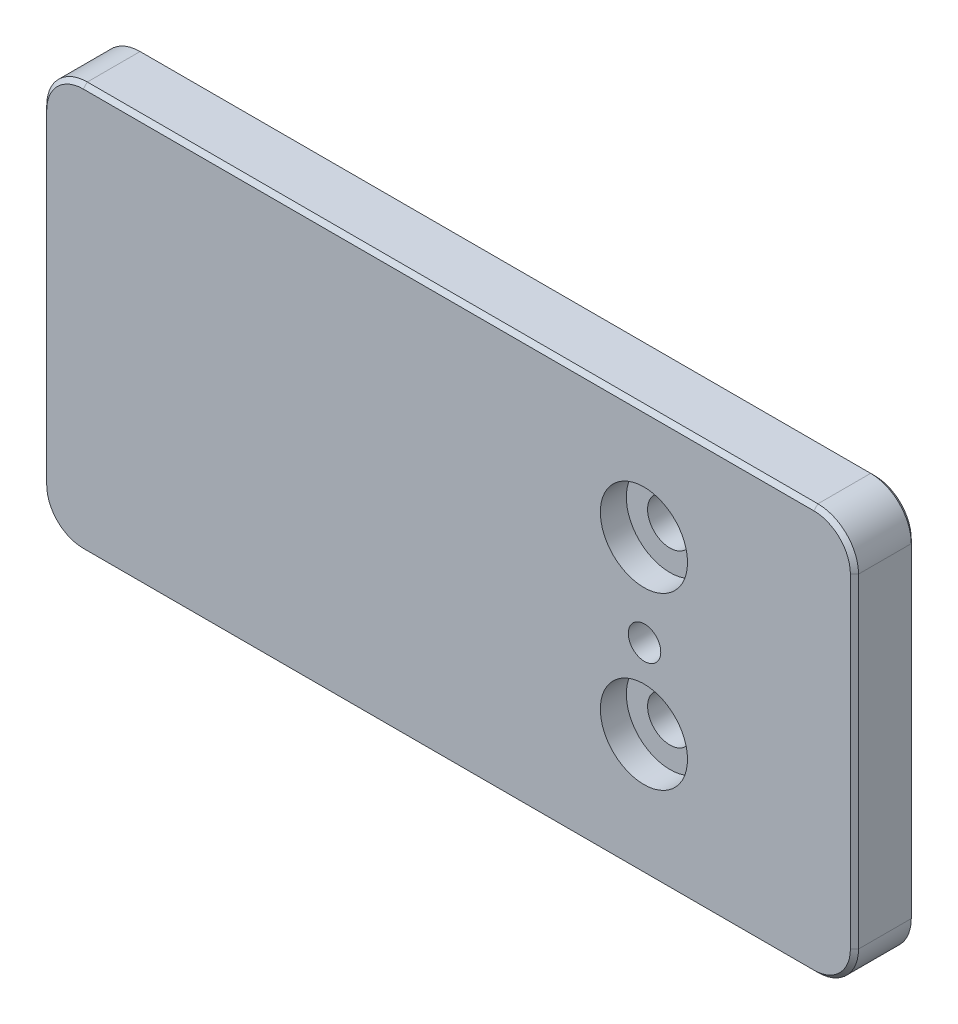
ISO-10303-21;
HEADER;
FILE_DESCRIPTION(('STEP AP214'),'2;1');
FILE_NAME('part.step','',(''),(''),'','','');
FILE_SCHEMA(('AUTOMOTIVE_DESIGN { 1 0 10303 214 1 1 1 1 }'));
ENDSEC;
DATA;
#1=APPLICATION_CONTEXT('core data for automotive mechanical design processes');
#2=APPLICATION_PROTOCOL_DEFINITION('international standard','automotive_design',2000,#1);
#3=PRODUCT_CONTEXT('',#1,'mechanical');
#4=PRODUCT('Part','Part','',(#3));
#5=PRODUCT_RELATED_PRODUCT_CATEGORY('part','',(#4));
#6=PRODUCT_DEFINITION_FORMATION('','',#4);
#7=PRODUCT_DEFINITION_CONTEXT('part definition',#1,'design');
#8=PRODUCT_DEFINITION('design','',#6,#7);
#9=PRODUCT_DEFINITION_SHAPE('','',#8);
#10=(LENGTH_UNIT() NAMED_UNIT(*) SI_UNIT(.MILLI.,.METRE.));
#11=(NAMED_UNIT(*) PLANE_ANGLE_UNIT() SI_UNIT($,.RADIAN.));
#12=(NAMED_UNIT(*) SI_UNIT($,.STERADIAN.) SOLID_ANGLE_UNIT());
#13=UNCERTAINTY_MEASURE_WITH_UNIT(LENGTH_MEASURE(1.E-05),#10,'distance_accuracy_value','');
#14=(GEOMETRIC_REPRESENTATION_CONTEXT(3) GLOBAL_UNCERTAINTY_ASSIGNED_CONTEXT((#13)) GLOBAL_UNIT_ASSIGNED_CONTEXT((#10,
#11,#12)) REPRESENTATION_CONTEXT('',''));
#15=CARTESIAN_POINT('',(0.,0.,0.));
#16=DIRECTION('',(0.,0.,1.));
#17=DIRECTION('',(1.,0.,0.));
#18=AXIS2_PLACEMENT_3D('',#15,#16,#17);
#19=CARTESIAN_POINT('',(100.,50.,15.));
#20=DIRECTION('',(-1.,0.,0.));
#21=DIRECTION('',(0.,0.,1.));
#22=AXIS2_PLACEMENT_3D('',#19,#20,#21);
#23=PLANE('',#22);
#24=DIRECTION('',(0.,0.,-1.));
#25=VECTOR('',#24,1.);
#26=CARTESIAN_POINT('',(100.,40.,15.));
#27=LINE('',#26,#25);
#28=CARTESIAN_POINT('',(100.,40.,0.999999999999973));
#29=VERTEX_POINT('',#28);
#30=CARTESIAN_POINT('',(100.,40.,14.));
#31=VERTEX_POINT('',#30);
#32=EDGE_CURVE('E331',#29,#31,#27,.F.);
#33=ORIENTED_EDGE('',*,*,#32,.T.);
#34=DIRECTION('',(0.,-1.,0.));
#35=VECTOR('',#34,1.);
#36=CARTESIAN_POINT('',(100.,-40.,14.));
#37=LINE('',#36,#35);
#38=CARTESIAN_POINT('',(100.,-40.,14.));
#39=VERTEX_POINT('',#38);
#40=EDGE_CURVE('E255',#31,#39,#37,.T.);
#41=ORIENTED_EDGE('',*,*,#40,.T.);
#42=DIRECTION('',(0.,0.,-1.));
#43=VECTOR('',#42,1.);
#44=CARTESIAN_POINT('',(100.,-40.,15.));
#45=LINE('',#44,#43);
#46=CARTESIAN_POINT('',(100.,-40.,0.999999999999973));
#47=VERTEX_POINT('',#46);
#48=EDGE_CURVE('E334',#39,#47,#45,.T.);
#49=ORIENTED_EDGE('',*,*,#48,.T.);
#50=DIRECTION('',(0.,1.,0.));
#51=VECTOR('',#50,1.);
#52=CARTESIAN_POINT('',(100.,50.,0.999999999999973));
#53=LINE('',#52,#51);
#54=EDGE_CURVE('E252',#47,#29,#53,.T.);
#55=ORIENTED_EDGE('',*,*,#54,.T.);
#56=EDGE_LOOP('',(#33,#41,#49,#55));
#57=FACE_BOUND('',#56,.T.);
#58=ADVANCED_FACE('F49',(#57),#23,.F.);
#59=CARTESIAN_POINT('',(-100.,50.,15.));
#60=DIRECTION('',(0.,-1.,0.));
#61=DIRECTION('',(0.,0.,-1.));
#62=AXIS2_PLACEMENT_3D('',#59,#60,#61);
#63=PLANE('',#62);
#64=DIRECTION('',(0.,0.,-1.));
#65=VECTOR('',#64,1.);
#66=CARTESIAN_POINT('',(-90.,50.,15.));
#67=LINE('',#66,#65);
#68=CARTESIAN_POINT('',(-90.,50.,0.999999999999973));
#69=VERTEX_POINT('',#68);
#70=CARTESIAN_POINT('',(-90.,50.,14.));
#71=VERTEX_POINT('',#70);
#72=EDGE_CURVE('E339',#69,#71,#67,.F.);
#73=ORIENTED_EDGE('',*,*,#72,.T.);
#74=DIRECTION('',(1.,0.,0.));
#75=VECTOR('',#74,1.);
#76=CARTESIAN_POINT('',(90.,50.,14.));
#77=LINE('',#76,#75);
#78=CARTESIAN_POINT('',(90.,50.,14.));
#79=VERTEX_POINT('',#78);
#80=EDGE_CURVE('E306',#71,#79,#77,.T.);
#81=ORIENTED_EDGE('',*,*,#80,.T.);
#82=DIRECTION('',(0.,0.,-1.));
#83=VECTOR('',#82,1.);
#84=CARTESIAN_POINT('',(90.,50.,15.));
#85=LINE('',#84,#83);
#86=CARTESIAN_POINT('',(90.,50.,0.999999999999973));
#87=VERTEX_POINT('',#86);
#88=EDGE_CURVE('E337',#79,#87,#85,.T.);
#89=ORIENTED_EDGE('',*,*,#88,.T.);
#90=DIRECTION('',(-1.,0.,0.));
#91=VECTOR('',#90,1.);
#92=CARTESIAN_POINT('',(-100.,50.,0.999999999999973));
#93=LINE('',#92,#91);
#94=EDGE_CURVE('E309',#87,#69,#93,.T.);
#95=ORIENTED_EDGE('',*,*,#94,.T.);
#96=EDGE_LOOP('',(#73,#81,#89,#95));
#97=FACE_BOUND('',#96,.T.);
#98=ADVANCED_FACE('F399',(#97),#63,.F.);
#99=CARTESIAN_POINT('',(-100.,50.,15.));
#100=DIRECTION('',(1.,0.,0.));
#101=DIRECTION('',(0.,0.,-1.));
#102=AXIS2_PLACEMENT_3D('',#99,#100,#101);
#103=PLANE('',#102);
#104=DIRECTION('',(0.,0.,-1.));
#105=VECTOR('',#104,1.);
#106=CARTESIAN_POINT('',(-100.,-40.,15.));
#107=LINE('',#106,#105);
#108=CARTESIAN_POINT('',(-100.,-40.,0.999999999999973));
#109=VERTEX_POINT('',#108);
#110=CARTESIAN_POINT('',(-100.,-40.,14.));
#111=VERTEX_POINT('',#110);
#112=EDGE_CURVE('E323',#109,#111,#107,.F.);
#113=ORIENTED_EDGE('',*,*,#112,.T.);
#114=DIRECTION('',(0.,1.,0.));
#115=VECTOR('',#114,1.);
#116=CARTESIAN_POINT('',(-100.,40.,14.));
#117=LINE('',#116,#115);
#118=CARTESIAN_POINT('',(-100.,40.,14.));
#119=VERTEX_POINT('',#118);
#120=EDGE_CURVE('E246',#111,#119,#117,.T.);
#121=ORIENTED_EDGE('',*,*,#120,.T.);
#122=DIRECTION('',(0.,0.,-1.));
#123=VECTOR('',#122,1.);
#124=CARTESIAN_POINT('',(-100.,40.,15.));
#125=LINE('',#124,#123);
#126=CARTESIAN_POINT('',(-100.,40.,0.999999999999973));
#127=VERTEX_POINT('',#126);
#128=EDGE_CURVE('E188',#119,#127,#125,.T.);
#129=ORIENTED_EDGE('',*,*,#128,.T.);
#130=DIRECTION('',(0.,-1.,0.));
#131=VECTOR('',#130,1.);
#132=CARTESIAN_POINT('',(-100.,50.,0.999999999999973));
#133=LINE('',#132,#131);
#134=EDGE_CURVE('E253',#127,#109,#133,.T.);
#135=ORIENTED_EDGE('',*,*,#134,.T.);
#136=EDGE_LOOP('',(#113,#121,#129,#135));
#137=FACE_BOUND('',#136,.T.);
#138=ADVANCED_FACE('F406',(#137),#103,.F.);
#139=CARTESIAN_POINT('',(-100.,-50.,15.));
#140=DIRECTION('',(0.,1.,0.));
#141=DIRECTION('',(0.,0.,1.));
#142=AXIS2_PLACEMENT_3D('',#139,#140,#141);
#143=PLANE('',#142);
#144=DIRECTION('',(0.,0.,-1.));
#145=VECTOR('',#144,1.);
#146=CARTESIAN_POINT('',(90.,-50.,15.));
#147=LINE('',#146,#145);
#148=CARTESIAN_POINT('',(90.,-50.,0.999999999999973));
#149=VERTEX_POINT('',#148);
#150=CARTESIAN_POINT('',(90.,-50.,14.));
#151=VERTEX_POINT('',#150);
#152=EDGE_CURVE('E325',#149,#151,#147,.F.);
#153=ORIENTED_EDGE('',*,*,#152,.T.);
#154=DIRECTION('',(-1.,0.,0.));
#155=VECTOR('',#154,1.);
#156=CARTESIAN_POINT('',(-90.,-50.,14.));
#157=LINE('',#156,#155);
#158=CARTESIAN_POINT('',(-90.,-50.,14.));
#159=VERTEX_POINT('',#158);
#160=EDGE_CURVE('E271',#151,#159,#157,.T.);
#161=ORIENTED_EDGE('',*,*,#160,.T.);
#162=DIRECTION('',(0.,0.,-1.));
#163=VECTOR('',#162,1.);
#164=CARTESIAN_POINT('',(-90.,-50.,15.));
#165=LINE('',#164,#163);
#166=CARTESIAN_POINT('',(-90.,-50.,0.999999999999973));
#167=VERTEX_POINT('',#166);
#168=EDGE_CURVE('E328',#159,#167,#165,.T.);
#169=ORIENTED_EDGE('',*,*,#168,.T.);
#170=DIRECTION('',(1.,0.,0.));
#171=VECTOR('',#170,1.);
#172=CARTESIAN_POINT('',(-100.,-50.,0.999999999999973));
#173=LINE('',#172,#171);
#174=EDGE_CURVE('E269',#167,#149,#173,.T.);
#175=ORIENTED_EDGE('',*,*,#174,.T.);
#176=EDGE_LOOP('',(#153,#161,#169,#175));
#177=FACE_BOUND('',#176,.T.);
#178=ADVANCED_FACE('F375',(#177),#143,.F.);
#179=CARTESIAN_POINT('',(0.,0.,15.));
#180=DIRECTION('',(0.,0.,1.));
#181=DIRECTION('',(1.,0.,0.));
#182=AXIS2_PLACEMENT_3D('',#179,#180,#181);
#183=PLANE('',#182);
#184=CARTESIAN_POINT('',(90.,40.,15.));
#185=DIRECTION('',(0.,0.,1.));
#186=DIRECTION('',(1.,0.,0.));
#187=AXIS2_PLACEMENT_3D('',#184,#185,#186);
#188=CIRCLE('',#187,8.99999999999999);
#189=CARTESIAN_POINT('',(99.,40.,15.));
#190=VERTEX_POINT('',#189);
#191=CARTESIAN_POINT('',(90.,49.,15.));
#192=VERTEX_POINT('',#191);
#193=EDGE_CURVE('E317',#190,#192,#188,.T.);
#194=ORIENTED_EDGE('',*,*,#193,.T.);
#195=DIRECTION('',(-1.,0.,0.));
#196=VECTOR('',#195,1.);
#197=CARTESIAN_POINT('',(-90.,49.,15.));
#198=LINE('',#197,#196);
#199=CARTESIAN_POINT('',(-90.,49.,15.));
#200=VERTEX_POINT('',#199);
#201=EDGE_CURVE('E312',#192,#200,#198,.T.);
#202=ORIENTED_EDGE('',*,*,#201,.T.);
#203=CARTESIAN_POINT('',(-90.,40.,15.));
#204=DIRECTION('',(0.,0.,1.));
#205=DIRECTION('',(1.,0.,0.));
#206=AXIS2_PLACEMENT_3D('',#203,#204,#205);
#207=CIRCLE('',#206,8.99999999999999);
#208=CARTESIAN_POINT('',(-99.,40.,15.));
#209=VERTEX_POINT('',#208);
#210=EDGE_CURVE('E315',#200,#209,#207,.T.);
#211=ORIENTED_EDGE('',*,*,#210,.T.);
#212=DIRECTION('',(0.,-1.,0.));
#213=VECTOR('',#212,1.);
#214=CARTESIAN_POINT('',(-99.,-40.,15.));
#215=LINE('',#214,#213);
#216=CARTESIAN_POINT('',(-99.,-40.,15.));
#217=VERTEX_POINT('',#216);
#218=EDGE_CURVE('E171',#209,#217,#215,.T.);
#219=ORIENTED_EDGE('',*,*,#218,.T.);
#220=CARTESIAN_POINT('',(-90.,-40.,15.));
#221=DIRECTION('',(0.,0.,1.));
#222=DIRECTION('',(1.,0.,0.));
#223=AXIS2_PLACEMENT_3D('',#220,#221,#222);
#224=CIRCLE('',#223,8.99999999999999);
#225=CARTESIAN_POINT('',(-90.,-49.,15.));
#226=VERTEX_POINT('',#225);
#227=EDGE_CURVE('E164',#217,#226,#224,.T.);
#228=ORIENTED_EDGE('',*,*,#227,.T.);
#229=DIRECTION('',(1.,0.,0.));
#230=VECTOR('',#229,1.);
#231=CARTESIAN_POINT('',(90.,-49.,15.));
#232=LINE('',#231,#230);
#233=CARTESIAN_POINT('',(90.,-49.,15.));
#234=VERTEX_POINT('',#233);
#235=EDGE_CURVE('E168',#226,#234,#232,.T.);
#236=ORIENTED_EDGE('',*,*,#235,.T.);
#237=CARTESIAN_POINT('',(90.,-40.,15.));
#238=DIRECTION('',(0.,0.,1.));
#239=DIRECTION('',(1.,0.,0.));
#240=AXIS2_PLACEMENT_3D('',#237,#238,#239);
#241=CIRCLE('',#240,8.99999999999999);
#242=CARTESIAN_POINT('',(99.,-40.,15.));
#243=VERTEX_POINT('',#242);
#244=EDGE_CURVE('E177',#234,#243,#241,.T.);
#245=ORIENTED_EDGE('',*,*,#244,.T.);
#246=DIRECTION('',(0.,1.,0.));
#247=VECTOR('',#246,1.);
#248=CARTESIAN_POINT('',(99.,40.,15.));
#249=LINE('',#248,#247);
#250=EDGE_CURVE('E176',#243,#190,#249,.T.);
#251=ORIENTED_EDGE('',*,*,#250,.T.);
#252=EDGE_LOOP('',(#194,#202,#211,#219,#228,#236,#245,#251));
#253=FACE_BOUND('',#252,.T.);
#254=CARTESIAN_POINT('',(48.2817024329452,0.,15.));
#255=DIRECTION('',(0.,0.,1.));
#256=DIRECTION('',(1.,0.,0.));
#257=AXIS2_PLACEMENT_3D('',#254,#255,#256);
#258=CIRCLE('',#257,4.);
#259=CARTESIAN_POINT('',(52.2817024329452,0.,15.));
#260=VERTEX_POINT('',#259);
#261=EDGE_CURVE('E194',#260,#260,#258,.T.);
#262=ORIENTED_EDGE('',*,*,#261,.F.);
#263=EDGE_LOOP('',(#262));
#264=FACE_BOUND('',#263,.T.);
#265=CARTESIAN_POINT('',(48.1326848328435,22.4271488153033,15.));
#266=DIRECTION('',(0.,0.,1.));
#267=DIRECTION('',(1.,0.,0.));
#268=AXIS2_PLACEMENT_3D('',#265,#266,#267);
#269=CIRCLE('',#268,10.7375);
#270=CARTESIAN_POINT('',(58.8701848328435,22.4271488153033,15.));
#271=VERTEX_POINT('',#270);
#272=EDGE_CURVE('E363',#271,#271,#269,.T.);
#273=ORIENTED_EDGE('',*,*,#272,.F.);
#274=EDGE_LOOP('',(#273));
#275=FACE_BOUND('',#274,.T.);
#276=CARTESIAN_POINT('',(48.1326848328435,-19.5958144133712,15.));
#277=DIRECTION('',(0.,0.,1.));
#278=DIRECTION('',(1.,0.,0.));
#279=AXIS2_PLACEMENT_3D('',#276,#277,#278);
#280=CIRCLE('',#279,10.7375);
#281=CARTESIAN_POINT('',(58.8701848328435,-19.5958144133712,15.));
#282=VERTEX_POINT('',#281);
#283=EDGE_CURVE('E351',#282,#282,#280,.T.);
#284=ORIENTED_EDGE('',*,*,#283,.F.);
#285=EDGE_LOOP('',(#284));
#286=FACE_BOUND('',#285,.T.);
#287=ADVANCED_FACE('F166',(#253,#264,#275,#286),#183,.T.);
#288=CARTESIAN_POINT('',(0.,0.,0.));
#289=DIRECTION('',(0.,0.,1.));
#290=DIRECTION('',(1.,0.,0.));
#291=AXIS2_PLACEMENT_3D('',#288,#289,#290);
#292=PLANE('',#291);
#293=CARTESIAN_POINT('',(-90.,40.,0.));
#294=DIRECTION('',(0.,0.,1.));
#295=DIRECTION('',(1.,0.,0.));
#296=AXIS2_PLACEMENT_3D('',#293,#294,#295);
#297=CIRCLE('',#296,9.00000000000003);
#298=CARTESIAN_POINT('',(-99.,40.,0.));
#299=VERTEX_POINT('',#298);
#300=CARTESIAN_POINT('',(-90.,49.,0.));
#301=VERTEX_POINT('',#300);
#302=EDGE_CURVE('E59',#299,#301,#297,.F.);
#303=ORIENTED_EDGE('',*,*,#302,.T.);
#304=DIRECTION('',(1.,0.,0.));
#305=VECTOR('',#304,1.);
#306=CARTESIAN_POINT('',(0.,49.,0.));
#307=LINE('',#306,#305);
#308=CARTESIAN_POINT('',(90.,49.,0.));
#309=VERTEX_POINT('',#308);
#310=EDGE_CURVE('E11',#301,#309,#307,.T.);
#311=ORIENTED_EDGE('',*,*,#310,.T.);
#312=CARTESIAN_POINT('',(90.,40.,0.));
#313=DIRECTION('',(0.,0.,1.));
#314=DIRECTION('',(1.,0.,0.));
#315=AXIS2_PLACEMENT_3D('',#312,#313,#314);
#316=CIRCLE('',#315,9.00000000000002);
#317=CARTESIAN_POINT('',(99.,40.,0.));
#318=VERTEX_POINT('',#317);
#319=EDGE_CURVE('E283',#309,#318,#316,.F.);
#320=ORIENTED_EDGE('',*,*,#319,.T.);
#321=DIRECTION('',(0.,-1.,0.));
#322=VECTOR('',#321,1.);
#323=CARTESIAN_POINT('',(99.,0.,0.));
#324=LINE('',#323,#322);
#325=CARTESIAN_POINT('',(99.,-40.,0.));
#326=VERTEX_POINT('',#325);
#327=EDGE_CURVE('E279',#318,#326,#324,.T.);
#328=ORIENTED_EDGE('',*,*,#327,.T.);
#329=CARTESIAN_POINT('',(90.,-40.,0.));
#330=DIRECTION('',(0.,0.,1.));
#331=DIRECTION('',(1.,0.,0.));
#332=AXIS2_PLACEMENT_3D('',#329,#330,#331);
#333=CIRCLE('',#332,9.00000000000003);
#334=CARTESIAN_POINT('',(90.,-49.,0.));
#335=VERTEX_POINT('',#334);
#336=EDGE_CURVE('E275',#326,#335,#333,.F.);
#337=ORIENTED_EDGE('',*,*,#336,.T.);
#338=DIRECTION('',(-1.,0.,0.));
#339=VECTOR('',#338,1.);
#340=CARTESIAN_POINT('',(0.,-49.,0.));
#341=LINE('',#340,#339);
#342=CARTESIAN_POINT('',(-90.,-49.,0.));
#343=VERTEX_POINT('',#342);
#344=EDGE_CURVE('E273',#335,#343,#341,.T.);
#345=ORIENTED_EDGE('',*,*,#344,.T.);
#346=CARTESIAN_POINT('',(-90.,-40.,0.));
#347=DIRECTION('',(0.,0.,1.));
#348=DIRECTION('',(1.,0.,0.));
#349=AXIS2_PLACEMENT_3D('',#346,#347,#348);
#350=CIRCLE('',#349,9.00000000000002);
#351=CARTESIAN_POINT('',(-99.,-40.,0.));
#352=VERTEX_POINT('',#351);
#353=EDGE_CURVE('E277',#343,#352,#350,.F.);
#354=ORIENTED_EDGE('',*,*,#353,.T.);
#355=DIRECTION('',(0.,1.,0.));
#356=VECTOR('',#355,1.);
#357=CARTESIAN_POINT('',(-99.,0.,0.));
#358=LINE('',#357,#356);
#359=EDGE_CURVE('E281',#352,#299,#358,.T.);
#360=ORIENTED_EDGE('',*,*,#359,.T.);
#361=EDGE_LOOP('',(#303,#311,#320,#328,#337,#345,#354,#360));
#362=FACE_BOUND('',#361,.T.);
#363=CARTESIAN_POINT('',(48.2817024329452,0.,0.));
#364=DIRECTION('',(0.,0.,1.));
#365=DIRECTION('',(1.,0.,0.));
#366=AXIS2_PLACEMENT_3D('',#363,#364,#365);
#367=CIRCLE('',#366,4.);
#368=CARTESIAN_POINT('',(52.2817024329452,0.,0.));
#369=VERTEX_POINT('',#368);
#370=EDGE_CURVE('E366',#369,#369,#367,.T.);
#371=ORIENTED_EDGE('',*,*,#370,.T.);
#372=EDGE_LOOP('',(#371));
#373=FACE_BOUND('',#372,.T.);
#374=CARTESIAN_POINT('',(48.1326848328435,22.4271488153033,0.));
#375=DIRECTION('',(0.,0.,1.));
#376=DIRECTION('',(1.,0.,0.));
#377=AXIS2_PLACEMENT_3D('',#374,#375,#376);
#378=CIRCLE('',#377,5.5);
#379=CARTESIAN_POINT('',(53.6326848328435,22.4271488153033,0.));
#380=VERTEX_POINT('',#379);
#381=EDGE_CURVE('E354',#380,#380,#378,.T.);
#382=ORIENTED_EDGE('',*,*,#381,.T.);
#383=EDGE_LOOP('',(#382));
#384=FACE_BOUND('',#383,.T.);
#385=CARTESIAN_POINT('',(48.1326848328435,-19.5958144133712,0.));
#386=DIRECTION('',(0.,0.,1.));
#387=DIRECTION('',(1.,0.,0.));
#388=AXIS2_PLACEMENT_3D('',#385,#386,#387);
#389=CIRCLE('',#388,5.5);
#390=CARTESIAN_POINT('',(53.6326848328435,-19.5958144133712,0.));
#391=VERTEX_POINT('',#390);
#392=EDGE_CURVE('E342',#391,#391,#389,.T.);
#393=ORIENTED_EDGE('',*,*,#392,.T.);
#394=EDGE_LOOP('',(#393));
#395=FACE_BOUND('',#394,.T.);
#396=ADVANCED_FACE('F285',(#362,#373,#384,#395),#292,.F.);
#397=CARTESIAN_POINT('',(90.,40.,15.));
#398=DIRECTION('',(0.,0.,-1.));
#399=DIRECTION('',(-1.,0.,0.));
#400=AXIS2_PLACEMENT_3D('',#397,#398,#399);
#401=CYLINDRICAL_SURFACE('',#400,10.);
#402=ORIENTED_EDGE('',*,*,#88,.F.);
#403=CARTESIAN_POINT('',(90.,40.,14.));
#404=DIRECTION('',(0.,0.,1.));
#405=DIRECTION('',(1.,0.,0.));
#406=AXIS2_PLACEMENT_3D('',#403,#404,#405);
#407=CIRCLE('',#406,10.);
#408=EDGE_CURVE('E257',#79,#31,#407,.F.);
#409=ORIENTED_EDGE('',*,*,#408,.T.);
#410=ORIENTED_EDGE('',*,*,#32,.F.);
#411=CARTESIAN_POINT('',(90.,40.,0.999999999999973));
#412=DIRECTION('',(0.,0.,1.));
#413=DIRECTION('',(1.,0.,0.));
#414=AXIS2_PLACEMENT_3D('',#411,#412,#413);
#415=CIRCLE('',#414,10.);
#416=EDGE_CURVE('E295',#29,#87,#415,.T.);
#417=ORIENTED_EDGE('',*,*,#416,.T.);
#418=EDGE_LOOP('',(#402,#409,#410,#417));
#419=FACE_BOUND('',#418,.T.);
#420=ADVANCED_FACE('F411',(#419),#401,.T.);
#421=CARTESIAN_POINT('',(90.,-40.,15.));
#422=DIRECTION('',(0.,0.,-1.));
#423=DIRECTION('',(-1.,0.,0.));
#424=AXIS2_PLACEMENT_3D('',#421,#422,#423);
#425=CYLINDRICAL_SURFACE('',#424,10.);
#426=ORIENTED_EDGE('',*,*,#48,.F.);
#427=CARTESIAN_POINT('',(90.,-40.,14.));
#428=DIRECTION('',(0.,0.,1.));
#429=DIRECTION('',(1.,0.,0.));
#430=AXIS2_PLACEMENT_3D('',#427,#428,#429);
#431=CIRCLE('',#430,10.);
#432=EDGE_CURVE('E267',#39,#151,#431,.F.);
#433=ORIENTED_EDGE('',*,*,#432,.T.);
#434=ORIENTED_EDGE('',*,*,#152,.F.);
#435=CARTESIAN_POINT('',(90.,-40.,0.999999999999973));
#436=DIRECTION('',(0.,0.,1.));
#437=DIRECTION('',(1.,0.,0.));
#438=AXIS2_PLACEMENT_3D('',#435,#436,#437);
#439=CIRCLE('',#438,10.);
#440=EDGE_CURVE('E265',#149,#47,#439,.T.);
#441=ORIENTED_EDGE('',*,*,#440,.T.);
#442=EDGE_LOOP('',(#426,#433,#434,#441));
#443=FACE_BOUND('',#442,.T.);
#444=ADVANCED_FACE('F414',(#443),#425,.T.);
#445=CARTESIAN_POINT('',(-90.,40.,15.));
#446=DIRECTION('',(0.,0.,-1.));
#447=DIRECTION('',(-1.,0.,0.));
#448=AXIS2_PLACEMENT_3D('',#445,#446,#447);
#449=CYLINDRICAL_SURFACE('',#448,10.);
#450=ORIENTED_EDGE('',*,*,#128,.F.);
#451=CARTESIAN_POINT('',(-90.,40.,14.));
#452=DIRECTION('',(0.,0.,1.));
#453=DIRECTION('',(1.,0.,0.));
#454=AXIS2_PLACEMENT_3D('',#451,#452,#453);
#455=CIRCLE('',#454,10.);
#456=EDGE_CURVE('E300',#119,#71,#455,.F.);
#457=ORIENTED_EDGE('',*,*,#456,.T.);
#458=ORIENTED_EDGE('',*,*,#72,.F.);
#459=CARTESIAN_POINT('',(-90.,40.,0.999999999999973));
#460=DIRECTION('',(0.,0.,1.));
#461=DIRECTION('',(1.,0.,0.));
#462=AXIS2_PLACEMENT_3D('',#459,#460,#461);
#463=CIRCLE('',#462,10.);
#464=EDGE_CURVE('E302',#69,#127,#463,.T.);
#465=ORIENTED_EDGE('',*,*,#464,.T.);
#466=EDGE_LOOP('',(#450,#457,#458,#465));
#467=FACE_BOUND('',#466,.T.);
#468=ADVANCED_FACE('F417',(#467),#449,.T.);
#469=CARTESIAN_POINT('',(-90.,-40.,15.));
#470=DIRECTION('',(0.,0.,-1.));
#471=DIRECTION('',(-1.,0.,0.));
#472=AXIS2_PLACEMENT_3D('',#469,#470,#471);
#473=CYLINDRICAL_SURFACE('',#472,10.);
#474=ORIENTED_EDGE('',*,*,#168,.F.);
#475=CARTESIAN_POINT('',(-90.,-40.,14.));
#476=DIRECTION('',(0.,0.,1.));
#477=DIRECTION('',(1.,0.,0.));
#478=AXIS2_PLACEMENT_3D('',#475,#476,#477);
#479=CIRCLE('',#478,10.);
#480=EDGE_CURVE('E191',#159,#111,#479,.F.);
#481=ORIENTED_EDGE('',*,*,#480,.T.);
#482=ORIENTED_EDGE('',*,*,#112,.F.);
#483=CARTESIAN_POINT('',(-90.,-40.,0.999999999999973));
#484=DIRECTION('',(0.,0.,1.));
#485=DIRECTION('',(1.,0.,0.));
#486=AXIS2_PLACEMENT_3D('',#483,#484,#485);
#487=CIRCLE('',#486,10.);
#488=EDGE_CURVE('E262',#109,#167,#487,.T.);
#489=ORIENTED_EDGE('',*,*,#488,.T.);
#490=EDGE_LOOP('',(#474,#481,#482,#489));
#491=FACE_BOUND('',#490,.T.);
#492=ADVANCED_FACE('F421',(#491),#473,.T.);
#493=CARTESIAN_POINT('',(48.1326848328435,-19.5958144133712,15.));
#494=DIRECTION('',(0.,0.,1.));
#495=DIRECTION('',(1.,0.,0.));
#496=AXIS2_PLACEMENT_3D('',#493,#494,#495);
#497=CYLINDRICAL_SURFACE('',#496,5.5);
#498=ORIENTED_EDGE('',*,*,#392,.F.);
#499=EDGE_LOOP('',(#498));
#500=FACE_BOUND('',#499,.T.);
#501=CARTESIAN_POINT('',(48.1326848328435,-19.5958144133712,8.6));
#502=DIRECTION('',(0.,0.,1.));
#503=DIRECTION('',(1.,0.,0.));
#504=AXIS2_PLACEMENT_3D('',#501,#502,#503);
#505=CIRCLE('',#504,5.5);
#506=CARTESIAN_POINT('',(53.6326848328435,-19.5958144133712,8.6));
#507=VERTEX_POINT('',#506);
#508=EDGE_CURVE('E345',#507,#507,#505,.T.);
#509=ORIENTED_EDGE('',*,*,#508,.T.);
#510=EDGE_LOOP('',(#509));
#511=FACE_BOUND('',#510,.T.);
#512=ADVANCED_FACE('F394',(#500,#511),#497,.F.);
#513=CARTESIAN_POINT('',(53.6326848328435,-19.5958144133712,8.6));
#514=DIRECTION('',(0.,0.,-1.));
#515=DIRECTION('',(-1.,0.,0.));
#516=AXIS2_PLACEMENT_3D('',#513,#514,#515);
#517=PLANE('',#516);
#518=ORIENTED_EDGE('',*,*,#508,.F.);
#519=EDGE_LOOP('',(#518));
#520=FACE_BOUND('',#519,.T.);
#521=CARTESIAN_POINT('',(48.1326848328435,-19.5958144133712,8.6));
#522=DIRECTION('',(0.,0.,1.));
#523=DIRECTION('',(1.,0.,0.));
#524=AXIS2_PLACEMENT_3D('',#521,#522,#523);
#525=CIRCLE('',#524,10.7375);
#526=CARTESIAN_POINT('',(58.8701848328435,-19.5958144133712,8.6));
#527=VERTEX_POINT('',#526);
#528=EDGE_CURVE('E348',#527,#527,#525,.T.);
#529=ORIENTED_EDGE('',*,*,#528,.T.);
#530=EDGE_LOOP('',(#529));
#531=FACE_BOUND('',#530,.T.);
#532=ADVANCED_FACE('F384',(#520,#531),#517,.F.);
#533=CARTESIAN_POINT('',(48.1326848328435,-19.5958144133712,15.));
#534=DIRECTION('',(0.,0.,1.));
#535=DIRECTION('',(1.,0.,0.));
#536=AXIS2_PLACEMENT_3D('',#533,#534,#535);
#537=CYLINDRICAL_SURFACE('',#536,10.7375);
#538=ORIENTED_EDGE('',*,*,#528,.F.);
#539=EDGE_LOOP('',(#538));
#540=FACE_BOUND('',#539,.T.);
#541=ORIENTED_EDGE('',*,*,#283,.T.);
#542=EDGE_LOOP('',(#541));
#543=FACE_BOUND('',#542,.T.);
#544=ADVANCED_FACE('F381',(#540,#543),#537,.F.);
#545=CARTESIAN_POINT('',(48.1326848328435,22.4271488153033,15.));
#546=DIRECTION('',(0.,0.,1.));
#547=DIRECTION('',(1.,0.,0.));
#548=AXIS2_PLACEMENT_3D('',#545,#546,#547);
#549=CYLINDRICAL_SURFACE('',#548,5.5);
#550=ORIENTED_EDGE('',*,*,#381,.F.);
#551=EDGE_LOOP('',(#550));
#552=FACE_BOUND('',#551,.T.);
#553=CARTESIAN_POINT('',(48.1326848328435,22.4271488153033,8.6));
#554=DIRECTION('',(0.,0.,1.));
#555=DIRECTION('',(1.,0.,0.));
#556=AXIS2_PLACEMENT_3D('',#553,#554,#555);
#557=CIRCLE('',#556,5.5);
#558=CARTESIAN_POINT('',(53.6326848328435,22.4271488153033,8.6));
#559=VERTEX_POINT('',#558);
#560=EDGE_CURVE('E357',#559,#559,#557,.T.);
#561=ORIENTED_EDGE('',*,*,#560,.T.);
#562=EDGE_LOOP('',(#561));
#563=FACE_BOUND('',#562,.T.);
#564=ADVANCED_FACE('F383',(#552,#563),#549,.F.);
#565=CARTESIAN_POINT('',(53.6326848328435,22.4271488153033,8.6));
#566=DIRECTION('',(0.,0.,-1.));
#567=DIRECTION('',(-1.,0.,0.));
#568=AXIS2_PLACEMENT_3D('',#565,#566,#567);
#569=PLANE('',#568);
#570=ORIENTED_EDGE('',*,*,#560,.F.);
#571=EDGE_LOOP('',(#570));
#572=FACE_BOUND('',#571,.T.);
#573=CARTESIAN_POINT('',(48.1326848328435,22.4271488153033,8.6));
#574=DIRECTION('',(0.,0.,1.));
#575=DIRECTION('',(1.,0.,0.));
#576=AXIS2_PLACEMENT_3D('',#573,#574,#575);
#577=CIRCLE('',#576,10.7375);
#578=CARTESIAN_POINT('',(58.8701848328435,22.4271488153033,8.6));
#579=VERTEX_POINT('',#578);
#580=EDGE_CURVE('E360',#579,#579,#577,.T.);
#581=ORIENTED_EDGE('',*,*,#580,.T.);
#582=EDGE_LOOP('',(#581));
#583=FACE_BOUND('',#582,.T.);
#584=ADVANCED_FACE('F391',(#572,#583),#569,.F.);
#585=CARTESIAN_POINT('',(48.1326848328435,22.4271488153033,15.));
#586=DIRECTION('',(0.,0.,1.));
#587=DIRECTION('',(1.,0.,0.));
#588=AXIS2_PLACEMENT_3D('',#585,#586,#587);
#589=CYLINDRICAL_SURFACE('',#588,10.7375);
#590=ORIENTED_EDGE('',*,*,#580,.F.);
#591=EDGE_LOOP('',(#590));
#592=FACE_BOUND('',#591,.T.);
#593=ORIENTED_EDGE('',*,*,#272,.T.);
#594=EDGE_LOOP('',(#593));
#595=FACE_BOUND('',#594,.T.);
#596=ADVANCED_FACE('F583',(#592,#595),#589,.F.);
#597=CARTESIAN_POINT('',(48.2817024329452,0.,15.));
#598=DIRECTION('',(0.,0.,1.));
#599=DIRECTION('',(1.,0.,0.));
#600=AXIS2_PLACEMENT_3D('',#597,#598,#599);
#601=CYLINDRICAL_SURFACE('',#600,4.);
#602=ORIENTED_EDGE('',*,*,#370,.F.);
#603=EDGE_LOOP('',(#602));
#604=FACE_BOUND('',#603,.T.);
#605=ORIENTED_EDGE('',*,*,#261,.T.);
#606=EDGE_LOOP('',(#605));
#607=FACE_BOUND('',#606,.T.);
#608=ADVANCED_FACE('F372',(#604,#607),#601,.F.);
#609=CARTESIAN_POINT('',(0.,-49.,15.));
#610=DIRECTION('',(0.,-0.707106781186547,0.707106781186547));
#611=DIRECTION('',(-1.,0.,0.));
#612=AXIS2_PLACEMENT_3D('',#609,#610,#611);
#613=PLANE('',#612);
#614=DIRECTION('',(0.,0.707106781186547,0.707106781186547));
#615=VECTOR('',#614,1.);
#616=CARTESIAN_POINT('',(-90.,-50.,14.));
#617=LINE('',#616,#615);
#618=EDGE_CURVE('E183',#159,#226,#617,.T.);
#619=ORIENTED_EDGE('',*,*,#618,.F.);
#620=ORIENTED_EDGE('',*,*,#160,.F.);
#621=DIRECTION('',(0.,-0.707106781186547,-0.707106781186547));
#622=VECTOR('',#621,1.);
#623=CARTESIAN_POINT('',(90.,-49.,15.));
#624=LINE('',#623,#622);
#625=EDGE_CURVE('E186',#234,#151,#624,.T.);
#626=ORIENTED_EDGE('',*,*,#625,.F.);
#627=ORIENTED_EDGE('',*,*,#235,.F.);
#628=EDGE_LOOP('',(#619,#620,#626,#627));
#629=FACE_BOUND('',#628,.T.);
#630=ADVANCED_FACE('F181',(#629),#613,.T.);
#631=CARTESIAN_POINT('',(90.,-40.,15.));
#632=DIRECTION('',(0.,0.,-1.));
#633=DIRECTION('',(-1.,0.,0.));
#634=AXIS2_PLACEMENT_3D('',#631,#632,#633);
#635=CONICAL_SURFACE('',#634,9.,0.785398163397447);
#636=ORIENTED_EDGE('',*,*,#625,.T.);
#637=ORIENTED_EDGE('',*,*,#432,.F.);
#638=DIRECTION('',(0.707106781186547,0.,-0.707106781186547));
#639=VECTOR('',#638,1.);
#640=CARTESIAN_POINT('',(99.,-40.,15.));
#641=LINE('',#640,#639);
#642=EDGE_CURVE('E192',#243,#39,#641,.T.);
#643=ORIENTED_EDGE('',*,*,#642,.F.);
#644=ORIENTED_EDGE('',*,*,#244,.F.);
#645=EDGE_LOOP('',(#636,#637,#643,#644));
#646=FACE_BOUND('',#645,.T.);
#647=ADVANCED_FACE('F464',(#646),#635,.T.);
#648=CARTESIAN_POINT('',(-90.,-40.,15.));
#649=DIRECTION('',(0.,0.,-1.));
#650=DIRECTION('',(-1.,0.,0.));
#651=AXIS2_PLACEMENT_3D('',#648,#649,#650);
#652=CONICAL_SURFACE('',#651,8.99999999999999,0.785398163397451);
#653=ORIENTED_EDGE('',*,*,#618,.T.);
#654=ORIENTED_EDGE('',*,*,#227,.F.);
#655=DIRECTION('',(0.707106781186547,0.,0.707106781186547));
#656=VECTOR('',#655,1.);
#657=CARTESIAN_POINT('',(-100.,-40.,14.));
#658=LINE('',#657,#656);
#659=EDGE_CURVE('E197',#111,#217,#658,.T.);
#660=ORIENTED_EDGE('',*,*,#659,.F.);
#661=ORIENTED_EDGE('',*,*,#480,.F.);
#662=EDGE_LOOP('',(#653,#654,#660,#661));
#663=FACE_BOUND('',#662,.T.);
#664=ADVANCED_FACE('F190',(#663),#652,.T.);
#665=CARTESIAN_POINT('',(99.,0.,15.));
#666=DIRECTION('',(0.707106781186547,0.,0.707106781186547));
#667=DIRECTION('',(0.,-1.,0.));
#668=AXIS2_PLACEMENT_3D('',#665,#666,#667);
#669=PLANE('',#668);
#670=ORIENTED_EDGE('',*,*,#642,.T.);
#671=ORIENTED_EDGE('',*,*,#40,.F.);
#672=DIRECTION('',(0.707106781186547,0.,-0.707106781186547));
#673=VECTOR('',#672,1.);
#674=CARTESIAN_POINT('',(99.,40.,15.));
#675=LINE('',#674,#673);
#676=EDGE_CURVE('E240',#190,#31,#675,.T.);
#677=ORIENTED_EDGE('',*,*,#676,.F.);
#678=ORIENTED_EDGE('',*,*,#250,.F.);
#679=EDGE_LOOP('',(#670,#671,#677,#678));
#680=FACE_BOUND('',#679,.T.);
#681=ADVANCED_FACE('F452',(#680),#669,.T.);
#682=CARTESIAN_POINT('',(-99.,0.,15.));
#683=DIRECTION('',(-0.707106781186547,0.,0.707106781186547));
#684=DIRECTION('',(0.,1.,0.));
#685=AXIS2_PLACEMENT_3D('',#682,#683,#684);
#686=PLANE('',#685);
#687=ORIENTED_EDGE('',*,*,#659,.T.);
#688=ORIENTED_EDGE('',*,*,#218,.F.);
#689=DIRECTION('',(0.707106781186547,0.,0.707106781186547));
#690=VECTOR('',#689,1.);
#691=CARTESIAN_POINT('',(-100.,40.,14.));
#692=LINE('',#691,#690);
#693=EDGE_CURVE('E234',#119,#209,#692,.T.);
#694=ORIENTED_EDGE('',*,*,#693,.F.);
#695=ORIENTED_EDGE('',*,*,#120,.F.);
#696=EDGE_LOOP('',(#687,#688,#694,#695));
#697=FACE_BOUND('',#696,.T.);
#698=ADVANCED_FACE('F244',(#697),#686,.T.);
#699=CARTESIAN_POINT('',(90.,40.,15.));
#700=DIRECTION('',(0.,0.,-1.));
#701=DIRECTION('',(-1.,0.,0.));
#702=AXIS2_PLACEMENT_3D('',#699,#700,#701);
#703=CONICAL_SURFACE('',#702,8.99999999999999,0.785398163397451);
#704=ORIENTED_EDGE('',*,*,#676,.T.);
#705=ORIENTED_EDGE('',*,*,#408,.F.);
#706=DIRECTION('',(0.,0.70710678118655,-0.707106781186545));
#707=VECTOR('',#706,1.);
#708=CARTESIAN_POINT('',(90.,49.,15.));
#709=LINE('',#708,#707);
#710=EDGE_CURVE('E227',#192,#79,#709,.T.);
#711=ORIENTED_EDGE('',*,*,#710,.F.);
#712=ORIENTED_EDGE('',*,*,#193,.F.);
#713=EDGE_LOOP('',(#704,#705,#711,#712));
#714=FACE_BOUND('',#713,.T.);
#715=ADVANCED_FACE('F439',(#714),#703,.T.);
#716=CARTESIAN_POINT('',(-90.,40.,15.));
#717=DIRECTION('',(0.,0.,-1.));
#718=DIRECTION('',(-1.,0.,0.));
#719=AXIS2_PLACEMENT_3D('',#716,#717,#718);
#720=CONICAL_SURFACE('',#719,9.,0.785398163397447);
#721=ORIENTED_EDGE('',*,*,#693,.T.);
#722=ORIENTED_EDGE('',*,*,#210,.F.);
#723=DIRECTION('',(0.,-0.70710678118655,0.707106781186545));
#724=VECTOR('',#723,1.);
#725=CARTESIAN_POINT('',(-90.,50.,14.));
#726=LINE('',#725,#724);
#727=EDGE_CURVE('E222',#71,#200,#726,.T.);
#728=ORIENTED_EDGE('',*,*,#727,.F.);
#729=ORIENTED_EDGE('',*,*,#456,.F.);
#730=EDGE_LOOP('',(#721,#722,#728,#729));
#731=FACE_BOUND('',#730,.T.);
#732=ADVANCED_FACE('F433',(#731),#720,.T.);
#733=CARTESIAN_POINT('',(0.,49.,15.));
#734=DIRECTION('',(0.,0.707106781186547,0.707106781186547));
#735=DIRECTION('',(1.,0.,0.));
#736=AXIS2_PLACEMENT_3D('',#733,#734,#735);
#737=PLANE('',#736);
#738=ORIENTED_EDGE('',*,*,#710,.T.);
#739=ORIENTED_EDGE('',*,*,#80,.F.);
#740=ORIENTED_EDGE('',*,*,#727,.T.);
#741=ORIENTED_EDGE('',*,*,#201,.F.);
#742=EDGE_LOOP('',(#738,#739,#740,#741));
#743=FACE_BOUND('',#742,.T.);
#744=ADVANCED_FACE('F427',(#743),#737,.T.);
#745=CARTESIAN_POINT('',(-100.,-50.,0.999999999999973));
#746=DIRECTION('',(0.,0.707106781186548,0.707106781186548));
#747=DIRECTION('',(1.,0.,0.));
#748=AXIS2_PLACEMENT_3D('',#745,#746,#747);
#749=PLANE('',#748);
#750=DIRECTION('',(0.,-0.707106781186548,0.707106781186548));
#751=VECTOR('',#750,1.);
#752=CARTESIAN_POINT('',(-90.,-49.,0.));
#753=LINE('',#752,#751);
#754=EDGE_CURVE('E215',#343,#167,#753,.T.);
#755=ORIENTED_EDGE('',*,*,#754,.F.);
#756=ORIENTED_EDGE('',*,*,#344,.F.);
#757=DIRECTION('',(0.,0.707106781186548,-0.707106781186548));
#758=VECTOR('',#757,1.);
#759=CARTESIAN_POINT('',(90.,-50.,0.999999999999973));
#760=LINE('',#759,#758);
#761=EDGE_CURVE('E54',#149,#335,#760,.T.);
#762=ORIENTED_EDGE('',*,*,#761,.F.);
#763=ORIENTED_EDGE('',*,*,#174,.F.);
#764=EDGE_LOOP('',(#755,#756,#762,#763));
#765=FACE_BOUND('',#764,.T.);
#766=ADVANCED_FACE('F52',(#765),#749,.F.);
#767=CARTESIAN_POINT('',(90.,-40.,0.));
#768=DIRECTION('',(0.,0.,1.));
#769=DIRECTION('',(1.,0.,0.));
#770=AXIS2_PLACEMENT_3D('',#767,#768,#769);
#771=CONICAL_SURFACE('',#770,9.00000000000003,0.785398163397447);
#772=ORIENTED_EDGE('',*,*,#761,.T.);
#773=ORIENTED_EDGE('',*,*,#336,.F.);
#774=DIRECTION('',(-0.707106781186548,0.,-0.707106781186548));
#775=VECTOR('',#774,1.);
#776=CARTESIAN_POINT('',(100.,-40.,0.999999999999973));
#777=LINE('',#776,#775);
#778=EDGE_CURVE('E213',#47,#326,#777,.T.);
#779=ORIENTED_EDGE('',*,*,#778,.F.);
#780=ORIENTED_EDGE('',*,*,#440,.F.);
#781=EDGE_LOOP('',(#772,#773,#779,#780));
#782=FACE_BOUND('',#781,.T.);
#783=ADVANCED_FACE('F511',(#782),#771,.T.);
#784=CARTESIAN_POINT('',(-90.,-40.,0.));
#785=DIRECTION('',(0.,0.,1.));
#786=DIRECTION('',(1.,0.,0.));
#787=AXIS2_PLACEMENT_3D('',#784,#785,#786);
#788=CONICAL_SURFACE('',#787,9.00000000000002,0.785398163397451);
#789=ORIENTED_EDGE('',*,*,#754,.T.);
#790=ORIENTED_EDGE('',*,*,#488,.F.);
#791=DIRECTION('',(-0.707106781186548,0.,0.707106781186548));
#792=VECTOR('',#791,1.);
#793=CARTESIAN_POINT('',(-99.,-40.,0.));
#794=LINE('',#793,#792);
#795=EDGE_CURVE('E210',#352,#109,#794,.T.);
#796=ORIENTED_EDGE('',*,*,#795,.F.);
#797=ORIENTED_EDGE('',*,*,#353,.F.);
#798=EDGE_LOOP('',(#789,#790,#796,#797));
#799=FACE_BOUND('',#798,.T.);
#800=ADVANCED_FACE('F506',(#799),#788,.T.);
#801=CARTESIAN_POINT('',(100.,50.,0.999999999999973));
#802=DIRECTION('',(-0.707106781186548,0.,0.707106781186548));
#803=DIRECTION('',(0.,1.,0.));
#804=AXIS2_PLACEMENT_3D('',#801,#802,#803);
#805=PLANE('',#804);
#806=ORIENTED_EDGE('',*,*,#778,.T.);
#807=ORIENTED_EDGE('',*,*,#327,.F.);
#808=DIRECTION('',(-0.707106781186548,0.,-0.707106781186548));
#809=VECTOR('',#808,1.);
#810=CARTESIAN_POINT('',(100.,40.,0.999999999999973));
#811=LINE('',#810,#809);
#812=EDGE_CURVE('E207',#29,#318,#811,.T.);
#813=ORIENTED_EDGE('',*,*,#812,.F.);
#814=ORIENTED_EDGE('',*,*,#54,.F.);
#815=EDGE_LOOP('',(#806,#807,#813,#814));
#816=FACE_BOUND('',#815,.T.);
#817=ADVANCED_FACE('F290',(#816),#805,.F.);
#818=CARTESIAN_POINT('',(-100.,50.,0.999999999999973));
#819=DIRECTION('',(0.707106781186548,0.,0.707106781186548));
#820=DIRECTION('',(0.,-1.,0.));
#821=AXIS2_PLACEMENT_3D('',#818,#819,#820);
#822=PLANE('',#821);
#823=ORIENTED_EDGE('',*,*,#795,.T.);
#824=ORIENTED_EDGE('',*,*,#134,.F.);
#825=DIRECTION('',(-0.707106781186548,0.,0.707106781186548));
#826=VECTOR('',#825,1.);
#827=CARTESIAN_POINT('',(-99.,40.,0.));
#828=LINE('',#827,#826);
#829=EDGE_CURVE('E204',#299,#127,#828,.T.);
#830=ORIENTED_EDGE('',*,*,#829,.F.);
#831=ORIENTED_EDGE('',*,*,#359,.F.);
#832=EDGE_LOOP('',(#823,#824,#830,#831));
#833=FACE_BOUND('',#832,.T.);
#834=ADVANCED_FACE('F494',(#833),#822,.F.);
#835=CARTESIAN_POINT('',(90.,40.,0.));
#836=DIRECTION('',(0.,0.,1.));
#837=DIRECTION('',(1.,0.,0.));
#838=AXIS2_PLACEMENT_3D('',#835,#836,#837);
#839=CONICAL_SURFACE('',#838,9.00000000000002,0.785398163397451);
#840=ORIENTED_EDGE('',*,*,#812,.T.);
#841=ORIENTED_EDGE('',*,*,#319,.F.);
#842=DIRECTION('',(0.,-0.70710678118655,-0.707106781186545));
#843=VECTOR('',#842,1.);
#844=CARTESIAN_POINT('',(90.,50.,0.999999999999973));
#845=LINE('',#844,#843);
#846=EDGE_CURVE('E72',#87,#309,#845,.T.);
#847=ORIENTED_EDGE('',*,*,#846,.F.);
#848=ORIENTED_EDGE('',*,*,#416,.F.);
#849=EDGE_LOOP('',(#840,#841,#847,#848));
#850=FACE_BOUND('',#849,.T.);
#851=ADVANCED_FACE('F294',(#850),#839,.T.);
#852=CARTESIAN_POINT('',(-90.,40.,0.));
#853=DIRECTION('',(0.,0.,1.));
#854=DIRECTION('',(1.,0.,0.));
#855=AXIS2_PLACEMENT_3D('',#852,#853,#854);
#856=CONICAL_SURFACE('',#855,9.00000000000003,0.785398163397447);
#857=ORIENTED_EDGE('',*,*,#829,.T.);
#858=ORIENTED_EDGE('',*,*,#464,.F.);
#859=DIRECTION('',(0.,0.707106781186548,0.707106781186548));
#860=VECTOR('',#859,1.);
#861=CARTESIAN_POINT('',(-90.,49.,0.));
#862=LINE('',#861,#860);
#863=EDGE_CURVE('E201',#301,#69,#862,.T.);
#864=ORIENTED_EDGE('',*,*,#863,.F.);
#865=ORIENTED_EDGE('',*,*,#302,.F.);
#866=EDGE_LOOP('',(#857,#858,#864,#865));
#867=FACE_BOUND('',#866,.T.);
#868=ADVANCED_FACE('F482',(#867),#856,.T.);
#869=CARTESIAN_POINT('',(-100.,50.,0.999999999999973));
#870=DIRECTION('',(0.,-0.707106781186548,0.707106781186548));
#871=DIRECTION('',(-1.,0.,0.));
#872=AXIS2_PLACEMENT_3D('',#869,#870,#871);
#873=PLANE('',#872);
#874=ORIENTED_EDGE('',*,*,#846,.T.);
#875=ORIENTED_EDGE('',*,*,#310,.F.);
#876=ORIENTED_EDGE('',*,*,#863,.T.);
#877=ORIENTED_EDGE('',*,*,#94,.F.);
#878=EDGE_LOOP('',(#874,#875,#876,#877));
#879=FACE_BOUND('',#878,.T.);
#880=ADVANCED_FACE('F476',(#879),#873,.F.);
#881=CLOSED_SHELL('',(#58,#98,#138,#178,#287,#396,#420,#444,#468,#492,#512,#532,#544,#564,#584,
#596,#608,#630,#647,#664,#681,#698,#715,#732,#744,#766,#783,#800,#817,#834,#851,#868,#880));
#882=MANIFOLD_SOLID_BREP('B2',#881);
#883=ADVANCED_BREP_SHAPE_REPRESENTATION('',(#18,#882),#14);
#884=SHAPE_DEFINITION_REPRESENTATION(#9,#883);
ENDSEC;
END-ISO-10303-21;
